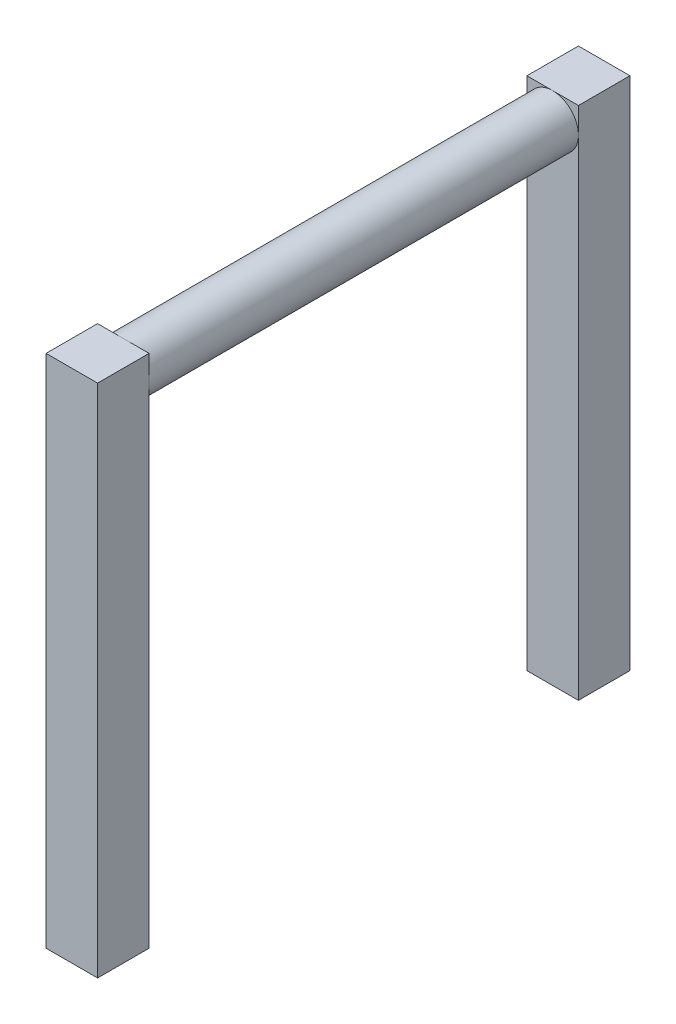
ISO-10303-21;
HEADER;
FILE_DESCRIPTION(('STEP AP214'),'2;1');
FILE_NAME('part.step','',(''),(''),'','','');
FILE_SCHEMA(('AUTOMOTIVE_DESIGN { 1 0 10303 214 1 1 1 1 }'));
ENDSEC;
DATA;
#1=APPLICATION_CONTEXT('core data for automotive mechanical design processes');
#2=APPLICATION_PROTOCOL_DEFINITION('international standard','automotive_design',2000,#1);
#3=PRODUCT_CONTEXT('',#1,'mechanical');
#4=PRODUCT('Part','Part','',(#3));
#5=PRODUCT_RELATED_PRODUCT_CATEGORY('part','',(#4));
#6=PRODUCT_DEFINITION_FORMATION('','',#4);
#7=PRODUCT_DEFINITION_CONTEXT('part definition',#1,'design');
#8=PRODUCT_DEFINITION('design','',#6,#7);
#9=PRODUCT_DEFINITION_SHAPE('','',#8);
#10=(LENGTH_UNIT() NAMED_UNIT(*) SI_UNIT(.MILLI.,.METRE.));
#11=(NAMED_UNIT(*) PLANE_ANGLE_UNIT() SI_UNIT($,.RADIAN.));
#12=(NAMED_UNIT(*) SI_UNIT($,.STERADIAN.) SOLID_ANGLE_UNIT());
#13=UNCERTAINTY_MEASURE_WITH_UNIT(LENGTH_MEASURE(1.E-05),#10,'distance_accuracy_value','');
#14=(GEOMETRIC_REPRESENTATION_CONTEXT(3) GLOBAL_UNCERTAINTY_ASSIGNED_CONTEXT((#13)) GLOBAL_UNIT_ASSIGNED_CONTEXT((#10,
#11,#12)) REPRESENTATION_CONTEXT('',''));
#15=CARTESIAN_POINT('',(0.,0.,0.));
#16=DIRECTION('',(0.,0.,1.));
#17=DIRECTION('',(1.,0.,0.));
#18=AXIS2_PLACEMENT_3D('',#15,#16,#17);
#19=CARTESIAN_POINT('',(6.,54.,-6.));
#20=DIRECTION('',(0.,0.,1.));
#21=DIRECTION('',(0.,-1.,0.));
#22=AXIS2_PLACEMENT_3D('',#19,#20,#21);
#23=PLANE('',#22);
#24=DIRECTION('',(0.,1.,0.));
#25=VECTOR('',#24,1.);
#26=CARTESIAN_POINT('',(6.,0.,-6.));
#27=LINE('',#26,#25);
#28=CARTESIAN_POINT('',(6.,57.,-6.));
#29=VERTEX_POINT('',#28);
#30=CARTESIAN_POINT('',(6.,60.,-6.));
#31=VERTEX_POINT('',#30);
#32=EDGE_CURVE('E156',#29,#31,#27,.T.);
#33=ORIENTED_EDGE('',*,*,#32,.F.);
#34=CARTESIAN_POINT('',(3.,57.,-6.));
#35=DIRECTION('',(0.,0.,1.));
#36=DIRECTION('',(0.,-1.,0.));
#37=AXIS2_PLACEMENT_3D('',#34,#35,#36);
#38=CIRCLE('',#37,3.);
#39=CARTESIAN_POINT('',(3.,60.,-6.));
#40=VERTEX_POINT('',#39);
#41=EDGE_CURVE('E44',#29,#40,#38,.T.);
#42=ORIENTED_EDGE('',*,*,#41,.T.);
#43=DIRECTION('',(-1.,0.,0.));
#44=VECTOR('',#43,1.);
#45=CARTESIAN_POINT('',(6.,60.,-6.));
#46=LINE('',#45,#44);
#47=EDGE_CURVE('E176',#31,#40,#46,.T.);
#48=ORIENTED_EDGE('',*,*,#47,.F.);
#49=EDGE_LOOP('',(#33,#42,#48));
#50=FACE_BOUND('',#49,.T.);
#51=ADVANCED_FACE('F33',(#50),#23,.F.);
#52=CARTESIAN_POINT('',(0.,60.,-6.));
#53=VERTEX_POINT('',#52);
#54=EDGE_CURVE('E175',#40,#53,#46,.T.);
#55=ORIENTED_EDGE('',*,*,#54,.F.);
#56=CARTESIAN_POINT('',(0.,57.,-6.));
#57=VERTEX_POINT('',#56);
#58=EDGE_CURVE('E11',#40,#57,#38,.T.);
#59=ORIENTED_EDGE('',*,*,#58,.T.);
#60=DIRECTION('',(0.,1.,0.));
#61=VECTOR('',#60,1.);
#62=CARTESIAN_POINT('',(0.,54.,-6.));
#63=LINE('',#62,#61);
#64=EDGE_CURVE('E168',#57,#53,#63,.T.);
#65=ORIENTED_EDGE('',*,*,#64,.T.);
#66=EDGE_LOOP('',(#55,#59,#65));
#67=FACE_BOUND('',#66,.T.);
#68=ADVANCED_FACE('F203',(#67),#23,.F.);
#69=CARTESIAN_POINT('',(6.,0.,0.));
#70=DIRECTION('',(0.,0.,-1.));
#71=DIRECTION('',(-1.,0.,0.));
#72=AXIS2_PLACEMENT_3D('',#69,#70,#71);
#73=PLANE('',#72);
#74=DIRECTION('',(0.,-1.,0.));
#75=VECTOR('',#74,1.);
#76=CARTESIAN_POINT('',(0.,0.,0.));
#77=LINE('',#76,#75);
#78=CARTESIAN_POINT('',(0.,60.,0.));
#79=VERTEX_POINT('',#78);
#80=CARTESIAN_POINT('',(0.,0.,0.));
#81=VERTEX_POINT('',#80);
#82=EDGE_CURVE('E147',#79,#81,#77,.T.);
#83=ORIENTED_EDGE('',*,*,#82,.T.);
#84=DIRECTION('',(-1.,0.,0.));
#85=VECTOR('',#84,1.);
#86=CARTESIAN_POINT('',(6.,0.,0.));
#87=LINE('',#86,#85);
#88=CARTESIAN_POINT('',(6.,0.,0.));
#89=VERTEX_POINT('',#88);
#90=EDGE_CURVE('E37',#89,#81,#87,.T.);
#91=ORIENTED_EDGE('',*,*,#90,.F.);
#92=DIRECTION('',(0.,-1.,0.));
#93=VECTOR('',#92,1.);
#94=CARTESIAN_POINT('',(6.,0.,0.));
#95=LINE('',#94,#93);
#96=CARTESIAN_POINT('',(6.,60.,0.));
#97=VERTEX_POINT('',#96);
#98=EDGE_CURVE('E150',#97,#89,#95,.T.);
#99=ORIENTED_EDGE('',*,*,#98,.F.);
#100=DIRECTION('',(-1.,0.,0.));
#101=VECTOR('',#100,1.);
#102=CARTESIAN_POINT('',(6.,60.,0.));
#103=LINE('',#102,#101);
#104=EDGE_CURVE('E162',#97,#79,#103,.T.);
#105=ORIENTED_EDGE('',*,*,#104,.T.);
#106=EDGE_LOOP('',(#83,#91,#99,#105));
#107=FACE_BOUND('',#106,.T.);
#108=ADVANCED_FACE('F35',(#107),#73,.F.);
#109=CARTESIAN_POINT('',(6.,0.,0.));
#110=DIRECTION('',(0.,1.,0.));
#111=DIRECTION('',(0.,0.,1.));
#112=AXIS2_PLACEMENT_3D('',#109,#110,#111);
#113=PLANE('',#112);
#114=DIRECTION('',(0.,0.,-1.));
#115=VECTOR('',#114,1.);
#116=CARTESIAN_POINT('',(0.,0.,0.));
#117=LINE('',#116,#115);
#118=CARTESIAN_POINT('',(0.,0.,-6.));
#119=VERTEX_POINT('',#118);
#120=EDGE_CURVE('E165',#81,#119,#117,.T.);
#121=ORIENTED_EDGE('',*,*,#120,.T.);
#122=DIRECTION('',(-1.,0.,0.));
#123=VECTOR('',#122,1.);
#124=CARTESIAN_POINT('',(6.,0.,-6.));
#125=LINE('',#124,#123);
#126=CARTESIAN_POINT('',(6.,0.,-6.));
#127=VERTEX_POINT('',#126);
#128=EDGE_CURVE('E178',#127,#119,#125,.T.);
#129=ORIENTED_EDGE('',*,*,#128,.F.);
#130=DIRECTION('',(0.,0.,-1.));
#131=VECTOR('',#130,1.);
#132=CARTESIAN_POINT('',(6.,0.,0.));
#133=LINE('',#132,#131);
#134=EDGE_CURVE('E153',#89,#127,#133,.T.);
#135=ORIENTED_EDGE('',*,*,#134,.F.);
#136=ORIENTED_EDGE('',*,*,#90,.T.);
#137=EDGE_LOOP('',(#121,#129,#135,#136));
#138=FACE_BOUND('',#137,.T.);
#139=ADVANCED_FACE('F195',(#138),#113,.F.);
#140=EDGE_CURVE('E169',#119,#57,#63,.T.);
#141=ORIENTED_EDGE('',*,*,#140,.T.);
#142=EDGE_CURVE('E42',#57,#29,#38,.T.);
#143=ORIENTED_EDGE('',*,*,#142,.T.);
#144=EDGE_CURVE('E157',#127,#29,#27,.T.);
#145=ORIENTED_EDGE('',*,*,#144,.F.);
#146=ORIENTED_EDGE('',*,*,#128,.T.);
#147=EDGE_LOOP('',(#141,#143,#145,#146));
#148=FACE_BOUND('',#147,.T.);
#149=ADVANCED_FACE('F187',(#148),#23,.F.);
#150=CARTESIAN_POINT('',(6.,60.,0.));
#151=DIRECTION('',(0.,-1.,0.));
#152=DIRECTION('',(0.,0.,-1.));
#153=AXIS2_PLACEMENT_3D('',#150,#151,#152);
#154=PLANE('',#153);
#155=DIRECTION('',(0.,0.,1.));
#156=VECTOR('',#155,1.);
#157=CARTESIAN_POINT('',(0.,60.,0.));
#158=LINE('',#157,#156);
#159=EDGE_CURVE('E154',#53,#79,#158,.T.);
#160=ORIENTED_EDGE('',*,*,#159,.T.);
#161=ORIENTED_EDGE('',*,*,#104,.F.);
#162=DIRECTION('',(0.,0.,1.));
#163=VECTOR('',#162,1.);
#164=CARTESIAN_POINT('',(6.,60.,0.));
#165=LINE('',#164,#163);
#166=EDGE_CURVE('E160',#31,#97,#165,.T.);
#167=ORIENTED_EDGE('',*,*,#166,.F.);
#168=ORIENTED_EDGE('',*,*,#47,.T.);
#169=ORIENTED_EDGE('',*,*,#54,.T.);
#170=EDGE_LOOP('',(#160,#161,#167,#168,#169));
#171=FACE_BOUND('',#170,.T.);
#172=ADVANCED_FACE('F225',(#171),#154,.F.);
#173=CARTESIAN_POINT('',(6.,0.,0.));
#174=DIRECTION('',(-1.,0.,0.));
#175=DIRECTION('',(0.,0.,1.));
#176=AXIS2_PLACEMENT_3D('',#173,#174,#175);
#177=PLANE('',#176);
#178=ORIENTED_EDGE('',*,*,#98,.T.);
#179=ORIENTED_EDGE('',*,*,#134,.T.);
#180=ORIENTED_EDGE('',*,*,#144,.T.);
#181=ORIENTED_EDGE('',*,*,#32,.T.);
#182=ORIENTED_EDGE('',*,*,#166,.T.);
#183=EDGE_LOOP('',(#178,#179,#180,#181,#182));
#184=FACE_BOUND('',#183,.T.);
#185=ADVANCED_FACE('F193',(#184),#177,.F.);
#186=CARTESIAN_POINT('',(0.,0.,0.));
#187=DIRECTION('',(-1.,0.,0.));
#188=DIRECTION('',(0.,0.,1.));
#189=AXIS2_PLACEMENT_3D('',#186,#187,#188);
#190=PLANE('',#189);
#191=ORIENTED_EDGE('',*,*,#82,.F.);
#192=ORIENTED_EDGE('',*,*,#159,.F.);
#193=ORIENTED_EDGE('',*,*,#64,.F.);
#194=ORIENTED_EDGE('',*,*,#140,.F.);
#195=ORIENTED_EDGE('',*,*,#120,.F.);
#196=EDGE_LOOP('',(#191,#192,#193,#194,#195));
#197=FACE_BOUND('',#196,.T.);
#198=ADVANCED_FACE('F198',(#197),#190,.T.);
#199=CARTESIAN_POINT('',(3.,57.,0.002000000000002));
#200=DIRECTION('',(0.,0.,-1.));
#201=DIRECTION('',(-1.,0.,0.));
#202=AXIS2_PLACEMENT_3D('',#199,#200,#201);
#203=CYLINDRICAL_SURFACE('',#202,3.);
#204=CARTESIAN_POINT('',(3.,57.,-56.));
#205=DIRECTION('',(0.,0.,1.));
#206=DIRECTION('',(1.,0.,0.));
#207=AXIS2_PLACEMENT_3D('',#204,#205,#206);
#208=CIRCLE('',#207,3.);
#209=CARTESIAN_POINT('',(6.,57.,-56.));
#210=VERTEX_POINT('',#209);
#211=CARTESIAN_POINT('',(3.,60.,-56.));
#212=VERTEX_POINT('',#211);
#213=EDGE_CURVE('E122',#210,#212,#208,.T.);
#214=ORIENTED_EDGE('',*,*,#213,.T.);
#215=CARTESIAN_POINT('',(0.,57.,-56.));
#216=VERTEX_POINT('',#215);
#217=EDGE_CURVE('E148',#212,#216,#208,.T.);
#218=ORIENTED_EDGE('',*,*,#217,.T.);
#219=EDGE_CURVE('E142',#216,#210,#208,.T.);
#220=ORIENTED_EDGE('',*,*,#219,.T.);
#221=EDGE_LOOP('',(#214,#218,#220));
#222=FACE_BOUND('',#221,.T.);
#223=ORIENTED_EDGE('',*,*,#41,.F.);
#224=ORIENTED_EDGE('',*,*,#142,.F.);
#225=ORIENTED_EDGE('',*,*,#58,.F.);
#226=EDGE_LOOP('',(#223,#224,#225));
#227=FACE_BOUND('',#226,.T.);
#228=ADVANCED_FACE('F204',(#222,#227),#203,.T.);
#229=CARTESIAN_POINT('',(6.,0.,-56.));
#230=DIRECTION('',(0.,0.,-1.));
#231=DIRECTION('',(-1.,0.,0.));
#232=AXIS2_PLACEMENT_3D('',#229,#230,#231);
#233=PLANE('',#232);
#234=ORIENTED_EDGE('',*,*,#213,.F.);
#235=DIRECTION('',(0.,-1.,0.));
#236=VECTOR('',#235,1.);
#237=CARTESIAN_POINT('',(6.,54.,-56.));
#238=LINE('',#237,#236);
#239=CARTESIAN_POINT('',(6.,60.,-56.));
#240=VERTEX_POINT('',#239);
#241=EDGE_CURVE('E51',#240,#210,#238,.T.);
#242=ORIENTED_EDGE('',*,*,#241,.F.);
#243=DIRECTION('',(-1.,0.,0.));
#244=VECTOR('',#243,1.);
#245=CARTESIAN_POINT('',(6.,60.,-56.));
#246=LINE('',#245,#244);
#247=EDGE_CURVE('E120',#240,#212,#246,.T.);
#248=ORIENTED_EDGE('',*,*,#247,.T.);
#249=EDGE_LOOP('',(#234,#242,#248));
#250=FACE_BOUND('',#249,.T.);
#251=ADVANCED_FACE('F118',(#250),#233,.F.);
#252=ORIENTED_EDGE('',*,*,#217,.F.);
#253=CARTESIAN_POINT('',(0.,60.,-56.));
#254=VERTEX_POINT('',#253);
#255=EDGE_CURVE('E140',#212,#254,#246,.T.);
#256=ORIENTED_EDGE('',*,*,#255,.T.);
#257=DIRECTION('',(0.,-1.,0.));
#258=VECTOR('',#257,1.);
#259=CARTESIAN_POINT('',(0.,0.,-56.));
#260=LINE('',#259,#258);
#261=EDGE_CURVE('E355',#254,#216,#260,.T.);
#262=ORIENTED_EDGE('',*,*,#261,.T.);
#263=EDGE_LOOP('',(#252,#256,#262));
#264=FACE_BOUND('',#263,.T.);
#265=ADVANCED_FACE('F212',(#264),#233,.F.);
#266=CARTESIAN_POINT('',(6.,60.,-56.));
#267=DIRECTION('',(0.,-1.,0.));
#268=DIRECTION('',(0.,0.,-1.));
#269=AXIS2_PLACEMENT_3D('',#266,#267,#268);
#270=PLANE('',#269);
#271=DIRECTION('',(0.,0.,1.));
#272=VECTOR('',#271,1.);
#273=CARTESIAN_POINT('',(0.,60.,-56.));
#274=LINE('',#273,#272);
#275=CARTESIAN_POINT('',(0.,60.,-62.));
#276=VERTEX_POINT('',#275);
#277=EDGE_CURVE('E351',#276,#254,#274,.T.);
#278=ORIENTED_EDGE('',*,*,#277,.T.);
#279=ORIENTED_EDGE('',*,*,#255,.F.);
#280=ORIENTED_EDGE('',*,*,#247,.F.);
#281=DIRECTION('',(0.,0.,1.));
#282=VECTOR('',#281,1.);
#283=CARTESIAN_POINT('',(6.,60.,-56.));
#284=LINE('',#283,#282);
#285=CARTESIAN_POINT('',(6.,60.,-62.));
#286=VERTEX_POINT('',#285);
#287=EDGE_CURVE('E128',#286,#240,#284,.T.);
#288=ORIENTED_EDGE('',*,*,#287,.F.);
#289=DIRECTION('',(-1.,0.,0.));
#290=VECTOR('',#289,1.);
#291=CARTESIAN_POINT('',(6.,60.,-62.));
#292=LINE('',#291,#290);
#293=EDGE_CURVE('E365',#286,#276,#292,.T.);
#294=ORIENTED_EDGE('',*,*,#293,.T.);
#295=EDGE_LOOP('',(#278,#279,#280,#288,#294));
#296=FACE_BOUND('',#295,.T.);
#297=ADVANCED_FACE('F139',(#296),#270,.F.);
#298=ORIENTED_EDGE('',*,*,#219,.F.);
#299=CARTESIAN_POINT('',(0.,0.,-56.));
#300=VERTEX_POINT('',#299);
#301=EDGE_CURVE('E356',#216,#300,#260,.T.);
#302=ORIENTED_EDGE('',*,*,#301,.T.);
#303=DIRECTION('',(-1.,0.,0.));
#304=VECTOR('',#303,1.);
#305=CARTESIAN_POINT('',(6.,0.,-56.));
#306=LINE('',#305,#304);
#307=CARTESIAN_POINT('',(6.,0.,-56.));
#308=VERTEX_POINT('',#307);
#309=EDGE_CURVE('E143',#308,#300,#306,.T.);
#310=ORIENTED_EDGE('',*,*,#309,.F.);
#311=EDGE_CURVE('E125',#210,#308,#238,.T.);
#312=ORIENTED_EDGE('',*,*,#311,.F.);
#313=EDGE_LOOP('',(#298,#302,#310,#312));
#314=FACE_BOUND('',#313,.T.);
#315=ADVANCED_FACE('F214',(#314),#233,.F.);
#316=CARTESIAN_POINT('',(6.,0.,-56.));
#317=DIRECTION('',(0.,1.,0.));
#318=DIRECTION('',(0.,0.,1.));
#319=AXIS2_PLACEMENT_3D('',#316,#317,#318);
#320=PLANE('',#319);
#321=DIRECTION('',(0.,0.,-1.));
#322=VECTOR('',#321,1.);
#323=CARTESIAN_POINT('',(0.,0.,-56.));
#324=LINE('',#323,#322);
#325=CARTESIAN_POINT('',(0.,0.,-62.));
#326=VERTEX_POINT('',#325);
#327=EDGE_CURVE('E362',#300,#326,#324,.T.);
#328=ORIENTED_EDGE('',*,*,#327,.T.);
#329=DIRECTION('',(-1.,0.,0.));
#330=VECTOR('',#329,1.);
#331=CARTESIAN_POINT('',(6.,0.,-62.));
#332=LINE('',#331,#330);
#333=CARTESIAN_POINT('',(6.,0.,-62.));
#334=VERTEX_POINT('',#333);
#335=EDGE_CURVE('E366',#334,#326,#332,.T.);
#336=ORIENTED_EDGE('',*,*,#335,.F.);
#337=DIRECTION('',(0.,0.,-1.));
#338=VECTOR('',#337,1.);
#339=CARTESIAN_POINT('',(6.,0.,-56.));
#340=LINE('',#339,#338);
#341=EDGE_CURVE('E124',#308,#334,#340,.T.);
#342=ORIENTED_EDGE('',*,*,#341,.F.);
#343=ORIENTED_EDGE('',*,*,#309,.T.);
#344=EDGE_LOOP('',(#328,#336,#342,#343));
#345=FACE_BOUND('',#344,.T.);
#346=ADVANCED_FACE('F307',(#345),#320,.F.);
#347=CARTESIAN_POINT('',(6.,0.,-62.));
#348=DIRECTION('',(0.,0.,1.));
#349=DIRECTION('',(1.,0.,0.));
#350=AXIS2_PLACEMENT_3D('',#347,#348,#349);
#351=PLANE('',#350);
#352=DIRECTION('',(0.,1.,0.));
#353=VECTOR('',#352,1.);
#354=CARTESIAN_POINT('',(0.,0.,-62.));
#355=LINE('',#354,#353);
#356=EDGE_CURVE('E135',#326,#276,#355,.T.);
#357=ORIENTED_EDGE('',*,*,#356,.T.);
#358=ORIENTED_EDGE('',*,*,#293,.F.);
#359=DIRECTION('',(0.,1.,0.));
#360=VECTOR('',#359,1.);
#361=CARTESIAN_POINT('',(6.,0.,-62.));
#362=LINE('',#361,#360);
#363=EDGE_CURVE('E131',#334,#286,#362,.T.);
#364=ORIENTED_EDGE('',*,*,#363,.F.);
#365=ORIENTED_EDGE('',*,*,#335,.T.);
#366=EDGE_LOOP('',(#357,#358,#364,#365));
#367=FACE_BOUND('',#366,.T.);
#368=ADVANCED_FACE('F317',(#367),#351,.F.);
#369=CARTESIAN_POINT('',(6.,0.,0.));
#370=DIRECTION('',(1.,0.,0.));
#371=DIRECTION('',(0.,0.,-1.));
#372=AXIS2_PLACEMENT_3D('',#369,#370,#371);
#373=PLANE('',#372);
#374=ORIENTED_EDGE('',*,*,#287,.T.);
#375=ORIENTED_EDGE('',*,*,#241,.T.);
#376=ORIENTED_EDGE('',*,*,#311,.T.);
#377=ORIENTED_EDGE('',*,*,#341,.T.);
#378=ORIENTED_EDGE('',*,*,#363,.T.);
#379=EDGE_LOOP('',(#374,#375,#376,#377,#378));
#380=FACE_BOUND('',#379,.T.);
#381=ADVANCED_FACE('F129',(#380),#373,.T.);
#382=CARTESIAN_POINT('',(0.,0.,0.));
#383=DIRECTION('',(1.,0.,0.));
#384=DIRECTION('',(0.,0.,-1.));
#385=AXIS2_PLACEMENT_3D('',#382,#383,#384);
#386=PLANE('',#385);
#387=ORIENTED_EDGE('',*,*,#277,.F.);
#388=ORIENTED_EDGE('',*,*,#356,.F.);
#389=ORIENTED_EDGE('',*,*,#327,.F.);
#390=ORIENTED_EDGE('',*,*,#301,.F.);
#391=ORIENTED_EDGE('',*,*,#261,.F.);
#392=EDGE_LOOP('',(#387,#388,#389,#390,#391));
#393=FACE_BOUND('',#392,.T.);
#394=ADVANCED_FACE('F336',(#393),#386,.F.);
#395=CLOSED_SHELL('',(#51,#68,#108,#139,#149,#172,#185,#198,#228,#251,#265,#297,#315,#346,#368,
#381,#394));
#396=MANIFOLD_SOLID_BREP('B2',#395);
#397=ADVANCED_BREP_SHAPE_REPRESENTATION('',(#18,#396),#14);
#398=SHAPE_DEFINITION_REPRESENTATION(#9,#397);
ENDSEC;
END-ISO-10303-21;
